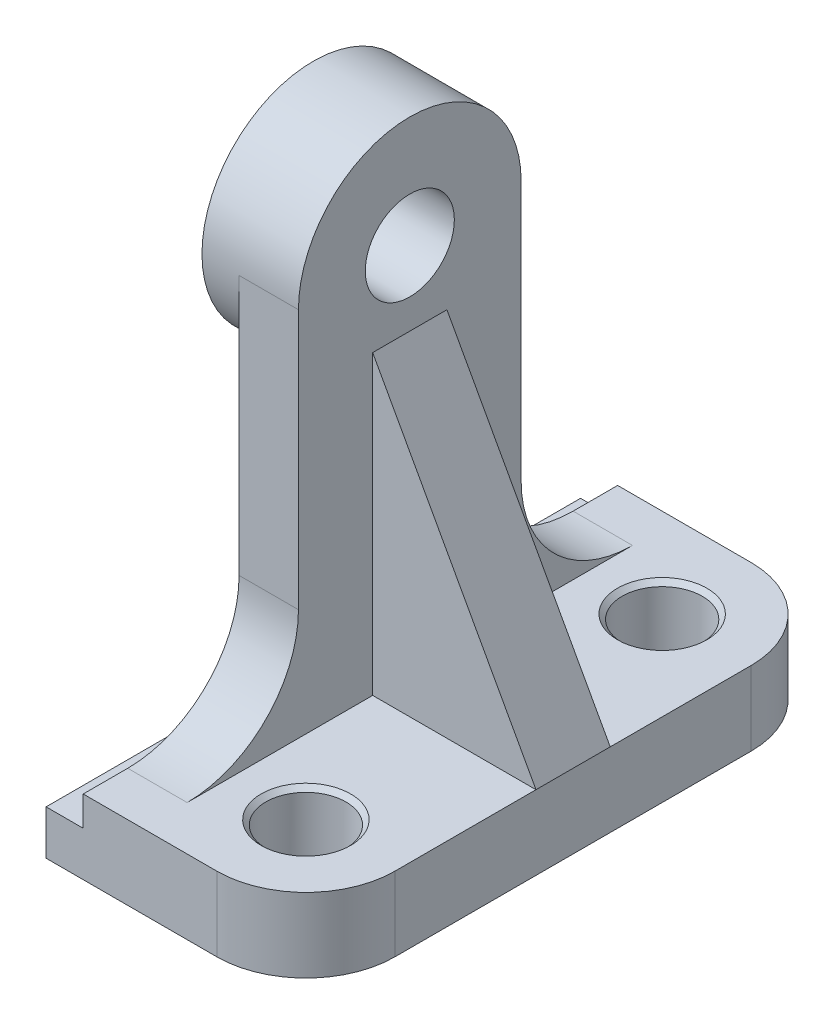
ISO-10303-21;
HEADER;
FILE_DESCRIPTION(('STEP AP214'),'2;1');
FILE_NAME('part.step','',(''),(''),'','','');
FILE_SCHEMA(('AUTOMOTIVE_DESIGN { 1 0 10303 214 1 1 1 1 }'));
ENDSEC;
DATA;
#1=APPLICATION_CONTEXT('core data for automotive mechanical design processes');
#2=APPLICATION_PROTOCOL_DEFINITION('international standard','automotive_design',2000,#1);
#3=PRODUCT_CONTEXT('',#1,'mechanical');
#4=PRODUCT('Part','Part','',(#3));
#5=PRODUCT_RELATED_PRODUCT_CATEGORY('part','',(#4));
#6=PRODUCT_DEFINITION_FORMATION('','',#4);
#7=PRODUCT_DEFINITION_CONTEXT('part definition',#1,'design');
#8=PRODUCT_DEFINITION('design','',#6,#7);
#9=PRODUCT_DEFINITION_SHAPE('','',#8);
#10=(LENGTH_UNIT() NAMED_UNIT(*) SI_UNIT(.MILLI.,.METRE.));
#11=(NAMED_UNIT(*) PLANE_ANGLE_UNIT() SI_UNIT($,.RADIAN.));
#12=(NAMED_UNIT(*) SI_UNIT($,.STERADIAN.) SOLID_ANGLE_UNIT());
#13=UNCERTAINTY_MEASURE_WITH_UNIT(LENGTH_MEASURE(1.E-05),#10,'distance_accuracy_value','');
#14=(GEOMETRIC_REPRESENTATION_CONTEXT(3) GLOBAL_UNCERTAINTY_ASSIGNED_CONTEXT((#13)) GLOBAL_UNIT_ASSIGNED_CONTEXT((#10,
#11,#12)) REPRESENTATION_CONTEXT('',''));
#15=CARTESIAN_POINT('',(0.,0.,0.));
#16=DIRECTION('',(0.,0.,1.));
#17=DIRECTION('',(1.,0.,0.));
#18=AXIS2_PLACEMENT_3D('',#15,#16,#17);
#19=CARTESIAN_POINT('',(5.,10.,36.));
#20=DIRECTION('',(0.,-1.,0.));
#21=DIRECTION('',(0.,0.,-1.));
#22=AXIS2_PLACEMENT_3D('',#19,#20,#21);
#23=PLANE('',#22);
#24=CARTESIAN_POINT('',(23.,10.,-24.));
#25=DIRECTION('',(0.,1.,0.));
#26=DIRECTION('',(0.,0.,1.));
#27=AXIS2_PLACEMENT_3D('',#24,#25,#26);
#28=CIRCLE('',#27,6.025);
#29=CARTESIAN_POINT('',(23.,10.,-17.975));
#30=VERTEX_POINT('',#29);
#31=EDGE_CURVE('E215',#30,#30,#28,.T.);
#32=ORIENTED_EDGE('',*,*,#31,.F.);
#33=EDGE_LOOP('',(#32));
#34=FACE_BOUND('',#33,.T.);
#35=DIRECTION('',(-1.,0.,0.));
#36=VECTOR('',#35,1.);
#37=CARTESIAN_POINT('',(5.,10.,-5.));
#38=LINE('',#37,#36);
#39=CARTESIAN_POINT('',(35.,10.,-5.));
#40=VERTEX_POINT('',#39);
#41=CARTESIAN_POINT('',(13.,10.,-5.));
#42=VERTEX_POINT('',#41);
#43=EDGE_CURVE('E67',#40,#42,#38,.T.);
#44=ORIENTED_EDGE('',*,*,#43,.F.);
#45=DIRECTION('',(0.,0.,-1.));
#46=VECTOR('',#45,1.);
#47=CARTESIAN_POINT('',(35.,10.,36.));
#48=LINE('',#47,#46);
#49=CARTESIAN_POINT('',(35.,10.,-24.));
#50=VERTEX_POINT('',#49);
#51=EDGE_CURVE('E316',#40,#50,#48,.T.);
#52=ORIENTED_EDGE('',*,*,#51,.T.);
#53=CARTESIAN_POINT('',(23.,10.,-24.));
#54=DIRECTION('',(0.,-1.,0.));
#55=DIRECTION('',(0.,0.,-1.));
#56=AXIS2_PLACEMENT_3D('',#53,#54,#55);
#57=CIRCLE('',#56,12.);
#58=CARTESIAN_POINT('',(23.,10.,-36.));
#59=VERTEX_POINT('',#58);
#60=EDGE_CURVE('E364',#50,#59,#57,.F.);
#61=ORIENTED_EDGE('',*,*,#60,.T.);
#62=DIRECTION('',(-1.,0.,0.));
#63=VECTOR('',#62,1.);
#64=CARTESIAN_POINT('',(5.,10.,-36.));
#65=LINE('',#64,#63);
#66=CARTESIAN_POINT('',(5.,10.,-36.));
#67=VERTEX_POINT('',#66);
#68=EDGE_CURVE('E289',#59,#67,#65,.T.);
#69=ORIENTED_EDGE('',*,*,#68,.T.);
#70=DIRECTION('',(0.,0.,-1.));
#71=VECTOR('',#70,1.);
#72=CARTESIAN_POINT('',(5.,10.,36.));
#73=LINE('',#72,#71);
#74=CARTESIAN_POINT('',(5.,10.,-30.));
#75=VERTEX_POINT('',#74);
#76=EDGE_CURVE('E311',#75,#67,#73,.T.);
#77=ORIENTED_EDGE('',*,*,#76,.F.);
#78=DIRECTION('',(-1.,0.,0.));
#79=VECTOR('',#78,1.);
#80=CARTESIAN_POINT('',(5.,10.,-30.));
#81=LINE('',#80,#79);
#82=CARTESIAN_POINT('',(13.,10.,-30.));
#83=VERTEX_POINT('',#82);
#84=EDGE_CURVE('E331',#75,#83,#81,.F.);
#85=ORIENTED_EDGE('',*,*,#84,.T.);
#86=DIRECTION('',(0.,0.,1.));
#87=VECTOR('',#86,1.);
#88=CARTESIAN_POINT('',(13.,10.,-15.));
#89=LINE('',#88,#87);
#90=EDGE_CURVE('E247',#83,#42,#89,.T.);
#91=ORIENTED_EDGE('',*,*,#90,.T.);
#92=EDGE_LOOP('',(#44,#52,#61,#69,#77,#85,#91));
#93=FACE_BOUND('',#92,.T.);
#94=ADVANCED_FACE('F49',(#34,#93),#23,.F.);
#95=CARTESIAN_POINT('',(5.,6.,36.));
#96=DIRECTION('',(1.,0.,0.));
#97=DIRECTION('',(0.,0.,-1.));
#98=AXIS2_PLACEMENT_3D('',#95,#96,#97);
#99=PLANE('',#98);
#100=DIRECTION('',(0.,1.,0.));
#101=VECTOR('',#100,1.);
#102=CARTESIAN_POINT('',(5.,10.,15.));
#103=LINE('',#102,#101);
#104=CARTESIAN_POINT('',(5.,25.,15.));
#105=VERTEX_POINT('',#104);
#106=CARTESIAN_POINT('',(5.,60.,15.));
#107=VERTEX_POINT('',#106);
#108=EDGE_CURVE('E242',#105,#107,#103,.T.);
#109=ORIENTED_EDGE('',*,*,#108,.T.);
#110=CARTESIAN_POINT('',(5.,60.,0.));
#111=DIRECTION('',(-1.,0.,0.));
#112=DIRECTION('',(0.,0.,1.));
#113=AXIS2_PLACEMENT_3D('',#110,#111,#112);
#114=CIRCLE('',#113,15.);
#115=CARTESIAN_POINT('',(5.,60.,-15.));
#116=VERTEX_POINT('',#115);
#117=EDGE_CURVE('E234',#116,#107,#114,.T.);
#118=ORIENTED_EDGE('',*,*,#117,.F.);
#119=DIRECTION('',(0.,-1.,0.));
#120=VECTOR('',#119,1.);
#121=CARTESIAN_POINT('',(5.,60.,-15.));
#122=LINE('',#121,#120);
#123=CARTESIAN_POINT('',(5.,25.,-15.));
#124=VERTEX_POINT('',#123);
#125=EDGE_CURVE('E233',#116,#124,#122,.T.);
#126=ORIENTED_EDGE('',*,*,#125,.T.);
#127=CARTESIAN_POINT('',(5.,25.,-30.));
#128=DIRECTION('',(1.,0.,0.));
#129=DIRECTION('',(0.,0.,-1.));
#130=AXIS2_PLACEMENT_3D('',#127,#128,#129);
#131=CIRCLE('',#130,15.);
#132=EDGE_CURVE('E338',#124,#75,#131,.T.);
#133=ORIENTED_EDGE('',*,*,#132,.T.);
#134=ORIENTED_EDGE('',*,*,#76,.T.);
#135=DIRECTION('',(0.,-1.,0.));
#136=VECTOR('',#135,1.);
#137=CARTESIAN_POINT('',(5.,6.,-36.));
#138=LINE('',#137,#136);
#139=CARTESIAN_POINT('',(5.,6.,-36.));
#140=VERTEX_POINT('',#139);
#141=EDGE_CURVE('E292',#67,#140,#138,.T.);
#142=ORIENTED_EDGE('',*,*,#141,.T.);
#143=DIRECTION('',(0.,0.,-1.));
#144=VECTOR('',#143,1.);
#145=CARTESIAN_POINT('',(5.,6.,36.));
#146=LINE('',#145,#144);
#147=CARTESIAN_POINT('',(5.,6.,36.));
#148=VERTEX_POINT('',#147);
#149=EDGE_CURVE('E308',#148,#140,#146,.T.);
#150=ORIENTED_EDGE('',*,*,#149,.F.);
#151=DIRECTION('',(0.,-1.,0.));
#152=VECTOR('',#151,1.);
#153=CARTESIAN_POINT('',(5.,6.,36.));
#154=LINE('',#153,#152);
#155=CARTESIAN_POINT('',(5.,10.,36.));
#156=VERTEX_POINT('',#155);
#157=EDGE_CURVE('E276',#156,#148,#154,.T.);
#158=ORIENTED_EDGE('',*,*,#157,.F.);
#159=CARTESIAN_POINT('',(5.,10.,30.));
#160=VERTEX_POINT('',#159);
#161=EDGE_CURVE('E312',#156,#160,#73,.T.);
#162=ORIENTED_EDGE('',*,*,#161,.T.);
#163=CARTESIAN_POINT('',(5.,25.,30.));
#164=DIRECTION('',(1.,0.,0.));
#165=DIRECTION('',(0.,0.,-1.));
#166=AXIS2_PLACEMENT_3D('',#163,#164,#165);
#167=CIRCLE('',#166,15.);
#168=EDGE_CURVE('E344',#160,#105,#167,.T.);
#169=ORIENTED_EDGE('',*,*,#168,.T.);
#170=EDGE_LOOP('',(#109,#118,#126,#133,#134,#142,#150,#158,#162,#169));
#171=FACE_BOUND('',#170,.T.);
#172=ADVANCED_FACE('F398',(#171),#99,.F.);
#173=CARTESIAN_POINT('',(23.,10.,24.));
#174=DIRECTION('',(0.,1.,0.));
#175=DIRECTION('',(0.,0.,1.));
#176=AXIS2_PLACEMENT_3D('',#173,#174,#175);
#177=CIRCLE('',#176,6.025);
#178=CARTESIAN_POINT('',(23.,10.,30.025));
#179=VERTEX_POINT('',#178);
#180=EDGE_CURVE('E207',#179,#179,#177,.T.);
#181=ORIENTED_EDGE('',*,*,#180,.F.);
#182=EDGE_LOOP('',(#181));
#183=FACE_BOUND('',#182,.T.);
#184=CARTESIAN_POINT('',(35.,10.,24.));
#185=VERTEX_POINT('',#184);
#186=CARTESIAN_POINT('',(35.,10.,5.));
#187=VERTEX_POINT('',#186);
#188=EDGE_CURVE('E317',#185,#187,#48,.T.);
#189=ORIENTED_EDGE('',*,*,#188,.T.);
#190=DIRECTION('',(-1.,0.,0.));
#191=VECTOR('',#190,1.);
#192=CARTESIAN_POINT('',(5.,10.,5.));
#193=LINE('',#192,#191);
#194=CARTESIAN_POINT('',(13.,10.,5.));
#195=VERTEX_POINT('',#194);
#196=EDGE_CURVE('E190',#187,#195,#193,.T.);
#197=ORIENTED_EDGE('',*,*,#196,.T.);
#198=CARTESIAN_POINT('',(13.,10.,30.));
#199=VERTEX_POINT('',#198);
#200=EDGE_CURVE('E246',#195,#199,#89,.T.);
#201=ORIENTED_EDGE('',*,*,#200,.T.);
#202=DIRECTION('',(-1.,0.,0.));
#203=VECTOR('',#202,1.);
#204=CARTESIAN_POINT('',(5.,10.,30.));
#205=LINE('',#204,#203);
#206=EDGE_CURVE('E327',#199,#160,#205,.T.);
#207=ORIENTED_EDGE('',*,*,#206,.T.);
#208=ORIENTED_EDGE('',*,*,#161,.F.);
#209=DIRECTION('',(-1.,0.,0.));
#210=VECTOR('',#209,1.);
#211=CARTESIAN_POINT('',(5.,10.,36.));
#212=LINE('',#211,#210);
#213=CARTESIAN_POINT('',(23.,10.,36.));
#214=VERTEX_POINT('',#213);
#215=EDGE_CURVE('E272',#214,#156,#212,.T.);
#216=ORIENTED_EDGE('',*,*,#215,.F.);
#217=CARTESIAN_POINT('',(23.,10.,24.));
#218=DIRECTION('',(0.,-1.,0.));
#219=DIRECTION('',(0.,0.,-1.));
#220=AXIS2_PLACEMENT_3D('',#217,#218,#219);
#221=CIRCLE('',#220,12.);
#222=EDGE_CURVE('E361',#214,#185,#221,.F.);
#223=ORIENTED_EDGE('',*,*,#222,.T.);
#224=EDGE_LOOP('',(#189,#197,#201,#207,#208,#216,#223));
#225=FACE_BOUND('',#224,.T.);
#226=ADVANCED_FACE('F401',(#183,#225),#23,.F.);
#227=CARTESIAN_POINT('',(35.,0.,36.));
#228=DIRECTION('',(0.,1.,0.));
#229=DIRECTION('',(-1.,0.,0.));
#230=AXIS2_PLACEMENT_3D('',#227,#228,#229);
#231=PLANE('',#230);
#232=CARTESIAN_POINT('',(23.,0.,24.));
#233=DIRECTION('',(0.,1.,0.));
#234=DIRECTION('',(-1.,0.,0.));
#235=AXIS2_PLACEMENT_3D('',#232,#233,#234);
#236=CIRCLE('',#235,5.4);
#237=CARTESIAN_POINT('',(17.6,0.,24.));
#238=VERTEX_POINT('',#237);
#239=EDGE_CURVE('E53',#238,#238,#236,.T.);
#240=ORIENTED_EDGE('',*,*,#239,.T.);
#241=EDGE_LOOP('',(#240));
#242=FACE_BOUND('',#241,.T.);
#243=DIRECTION('',(0.,0.,-1.));
#244=VECTOR('',#243,1.);
#245=CARTESIAN_POINT('',(0.,0.,36.));
#246=LINE('',#245,#244);
#247=CARTESIAN_POINT('',(0.,0.,36.));
#248=VERTEX_POINT('',#247);
#249=CARTESIAN_POINT('',(0.,0.,-36.));
#250=VERTEX_POINT('',#249);
#251=EDGE_CURVE('E285',#248,#250,#246,.T.);
#252=ORIENTED_EDGE('',*,*,#251,.T.);
#253=DIRECTION('',(1.,0.,0.));
#254=VECTOR('',#253,1.);
#255=CARTESIAN_POINT('',(35.,0.,-36.));
#256=LINE('',#255,#254);
#257=CARTESIAN_POINT('',(23.,0.,-36.));
#258=VERTEX_POINT('',#257);
#259=EDGE_CURVE('E264',#250,#258,#256,.T.);
#260=ORIENTED_EDGE('',*,*,#259,.T.);
#261=CARTESIAN_POINT('',(23.,0.,-24.));
#262=DIRECTION('',(0.,1.,0.));
#263=DIRECTION('',(-1.,0.,0.));
#264=AXIS2_PLACEMENT_3D('',#261,#262,#263);
#265=CIRCLE('',#264,12.);
#266=CARTESIAN_POINT('',(35.,0.,-24.));
#267=VERTEX_POINT('',#266);
#268=EDGE_CURVE('E59',#258,#267,#265,.F.);
#269=ORIENTED_EDGE('',*,*,#268,.T.);
#270=DIRECTION('',(0.,0.,-1.));
#271=VECTOR('',#270,1.);
#272=CARTESIAN_POINT('',(35.,0.,36.));
#273=LINE('',#272,#271);
#274=CARTESIAN_POINT('',(35.,0.,24.));
#275=VERTEX_POINT('',#274);
#276=EDGE_CURVE('E320',#275,#267,#273,.T.);
#277=ORIENTED_EDGE('',*,*,#276,.F.);
#278=CARTESIAN_POINT('',(23.,0.,24.));
#279=DIRECTION('',(0.,1.,0.));
#280=DIRECTION('',(-1.,0.,0.));
#281=AXIS2_PLACEMENT_3D('',#278,#279,#280);
#282=CIRCLE('',#281,12.);
#283=CARTESIAN_POINT('',(23.,0.,36.));
#284=VERTEX_POINT('',#283);
#285=EDGE_CURVE('E370',#275,#284,#282,.F.);
#286=ORIENTED_EDGE('',*,*,#285,.T.);
#287=DIRECTION('',(1.,0.,0.));
#288=VECTOR('',#287,1.);
#289=CARTESIAN_POINT('',(35.,0.,36.));
#290=LINE('',#289,#288);
#291=EDGE_CURVE('E268',#248,#284,#290,.T.);
#292=ORIENTED_EDGE('',*,*,#291,.F.);
#293=EDGE_LOOP('',(#252,#260,#269,#277,#286,#292));
#294=FACE_BOUND('',#293,.T.);
#295=CARTESIAN_POINT('',(23.,0.,-24.));
#296=DIRECTION('',(0.,1.,0.));
#297=DIRECTION('',(-1.,0.,0.));
#298=AXIS2_PLACEMENT_3D('',#295,#296,#297);
#299=CIRCLE('',#298,5.4);
#300=CARTESIAN_POINT('',(17.6,0.,-24.));
#301=VERTEX_POINT('',#300);
#302=EDGE_CURVE('E223',#301,#301,#299,.T.);
#303=ORIENTED_EDGE('',*,*,#302,.T.);
#304=EDGE_LOOP('',(#303));
#305=FACE_BOUND('',#304,.T.);
#306=ADVANCED_FACE('F379',(#242,#294,#305),#231,.F.);
#307=CARTESIAN_POINT('',(35.,10.,36.));
#308=DIRECTION('',(-1.,0.,0.));
#309=DIRECTION('',(0.,0.,1.));
#310=AXIS2_PLACEMENT_3D('',#307,#308,#309);
#311=PLANE('',#310);
#312=ORIENTED_EDGE('',*,*,#276,.T.);
#313=DIRECTION('',(0.,1.,0.));
#314=VECTOR('',#313,1.);
#315=CARTESIAN_POINT('',(35.,10.,-24.));
#316=LINE('',#315,#314);
#317=EDGE_CURVE('E357',#267,#50,#316,.T.);
#318=ORIENTED_EDGE('',*,*,#317,.T.);
#319=ORIENTED_EDGE('',*,*,#51,.F.);
#320=DIRECTION('',(0.,0.,-1.));
#321=VECTOR('',#320,1.);
#322=CARTESIAN_POINT('',(35.,10.,36.));
#323=LINE('',#322,#321);
#324=EDGE_CURVE('E74',#187,#40,#323,.T.);
#325=ORIENTED_EDGE('',*,*,#324,.F.);
#326=ORIENTED_EDGE('',*,*,#188,.F.);
#327=DIRECTION('',(0.,1.,0.));
#328=VECTOR('',#327,1.);
#329=CARTESIAN_POINT('',(35.,10.,24.));
#330=LINE('',#329,#328);
#331=EDGE_CURVE('E351',#185,#275,#330,.F.);
#332=ORIENTED_EDGE('',*,*,#331,.T.);
#333=EDGE_LOOP('',(#312,#318,#319,#325,#326,#332));
#334=FACE_BOUND('',#333,.T.);
#335=ADVANCED_FACE('F415',(#334),#311,.F.);
#336=CARTESIAN_POINT('',(0.,6.,36.));
#337=DIRECTION('',(0.,-1.,0.));
#338=DIRECTION('',(0.,0.,-1.));
#339=AXIS2_PLACEMENT_3D('',#336,#337,#338);
#340=PLANE('',#339);
#341=ORIENTED_EDGE('',*,*,#149,.T.);
#342=DIRECTION('',(-1.,0.,0.));
#343=VECTOR('',#342,1.);
#344=CARTESIAN_POINT('',(0.,6.,-36.));
#345=LINE('',#344,#343);
#346=CARTESIAN_POINT('',(0.,6.,-36.));
#347=VERTEX_POINT('',#346);
#348=EDGE_CURVE('E296',#140,#347,#345,.T.);
#349=ORIENTED_EDGE('',*,*,#348,.T.);
#350=DIRECTION('',(0.,0.,-1.));
#351=VECTOR('',#350,1.);
#352=CARTESIAN_POINT('',(0.,6.,36.));
#353=LINE('',#352,#351);
#354=CARTESIAN_POINT('',(0.,6.,36.));
#355=VERTEX_POINT('',#354);
#356=EDGE_CURVE('E305',#355,#347,#353,.T.);
#357=ORIENTED_EDGE('',*,*,#356,.F.);
#358=DIRECTION('',(-1.,0.,0.));
#359=VECTOR('',#358,1.);
#360=CARTESIAN_POINT('',(0.,6.,36.));
#361=LINE('',#360,#359);
#362=EDGE_CURVE('E279',#148,#355,#361,.T.);
#363=ORIENTED_EDGE('',*,*,#362,.F.);
#364=EDGE_LOOP('',(#341,#349,#357,#363));
#365=FACE_BOUND('',#364,.T.);
#366=ADVANCED_FACE('F476',(#365),#340,.F.);
#367=CARTESIAN_POINT('',(0.,0.,36.));
#368=DIRECTION('',(1.,0.,0.));
#369=DIRECTION('',(0.,0.,-1.));
#370=AXIS2_PLACEMENT_3D('',#367,#368,#369);
#371=PLANE('',#370);
#372=ORIENTED_EDGE('',*,*,#356,.T.);
#373=DIRECTION('',(0.,-1.,0.));
#374=VECTOR('',#373,1.);
#375=CARTESIAN_POINT('',(0.,0.,-36.));
#376=LINE('',#375,#374);
#377=EDGE_CURVE('E273',#347,#250,#376,.T.);
#378=ORIENTED_EDGE('',*,*,#377,.T.);
#379=ORIENTED_EDGE('',*,*,#251,.F.);
#380=DIRECTION('',(0.,-1.,0.));
#381=VECTOR('',#380,1.);
#382=CARTESIAN_POINT('',(0.,0.,36.));
#383=LINE('',#382,#381);
#384=EDGE_CURVE('E282',#355,#248,#383,.T.);
#385=ORIENTED_EDGE('',*,*,#384,.F.);
#386=EDGE_LOOP('',(#372,#378,#379,#385));
#387=FACE_BOUND('',#386,.T.);
#388=ADVANCED_FACE('F454',(#387),#371,.F.);
#389=CARTESIAN_POINT('',(0.,0.,36.));
#390=DIRECTION('',(0.,0.,-1.));
#391=DIRECTION('',(-1.,0.,0.));
#392=AXIS2_PLACEMENT_3D('',#389,#390,#391);
#393=PLANE('',#392);
#394=ORIENTED_EDGE('',*,*,#291,.T.);
#395=DIRECTION('',(0.,1.,0.));
#396=VECTOR('',#395,1.);
#397=CARTESIAN_POINT('',(23.,0.,36.));
#398=LINE('',#397,#396);
#399=EDGE_CURVE('E11',#284,#214,#398,.T.);
#400=ORIENTED_EDGE('',*,*,#399,.T.);
#401=ORIENTED_EDGE('',*,*,#215,.T.);
#402=ORIENTED_EDGE('',*,*,#157,.T.);
#403=ORIENTED_EDGE('',*,*,#362,.T.);
#404=ORIENTED_EDGE('',*,*,#384,.T.);
#405=EDGE_LOOP('',(#394,#400,#401,#402,#403,#404));
#406=FACE_BOUND('',#405,.T.);
#407=ADVANCED_FACE('F469',(#406),#393,.F.);
#408=CARTESIAN_POINT('',(0.,0.,-36.));
#409=DIRECTION('',(0.,0.,-1.));
#410=DIRECTION('',(-1.,0.,0.));
#411=AXIS2_PLACEMENT_3D('',#408,#409,#410);
#412=PLANE('',#411);
#413=ORIENTED_EDGE('',*,*,#68,.F.);
#414=DIRECTION('',(0.,1.,0.));
#415=VECTOR('',#414,1.);
#416=CARTESIAN_POINT('',(23.,0.,-36.));
#417=LINE('',#416,#415);
#418=EDGE_CURVE('E367',#59,#258,#417,.F.);
#419=ORIENTED_EDGE('',*,*,#418,.T.);
#420=ORIENTED_EDGE('',*,*,#259,.F.);
#421=ORIENTED_EDGE('',*,*,#377,.F.);
#422=ORIENTED_EDGE('',*,*,#348,.F.);
#423=ORIENTED_EDGE('',*,*,#141,.F.);
#424=EDGE_LOOP('',(#413,#419,#420,#421,#422,#423));
#425=FACE_BOUND('',#424,.T.);
#426=ADVANCED_FACE('F459',(#425),#412,.T.);
#427=CARTESIAN_POINT('',(13.,60.,0.));
#428=DIRECTION('',(-1.,0.,0.));
#429=DIRECTION('',(0.,0.,1.));
#430=AXIS2_PLACEMENT_3D('',#427,#428,#429);
#431=CYLINDRICAL_SURFACE('',#430,15.);
#432=CARTESIAN_POINT('',(0.,60.,0.));
#433=DIRECTION('',(-1.,0.,0.));
#434=DIRECTION('',(0.,0.,1.));
#435=AXIS2_PLACEMENT_3D('',#432,#433,#434);
#436=CIRCLE('',#435,15.);
#437=CARTESIAN_POINT('',(0.,60.,15.));
#438=VERTEX_POINT('',#437);
#439=EDGE_CURVE('E229',#438,#438,#436,.T.);
#440=ORIENTED_EDGE('',*,*,#439,.F.);
#441=EDGE_LOOP('',(#440));
#442=FACE_BOUND('',#441,.T.);
#443=ORIENTED_EDGE('',*,*,#117,.T.);
#444=DIRECTION('',(-1.,0.,0.));
#445=VECTOR('',#444,1.);
#446=CARTESIAN_POINT('',(13.,60.,15.));
#447=LINE('',#446,#445);
#448=CARTESIAN_POINT('',(13.,60.,15.));
#449=VERTEX_POINT('',#448);
#450=EDGE_CURVE('E260',#449,#107,#447,.T.);
#451=ORIENTED_EDGE('',*,*,#450,.F.);
#452=CARTESIAN_POINT('',(13.,60.,0.));
#453=DIRECTION('',(-1.,0.,0.));
#454=DIRECTION('',(0.,0.,1.));
#455=AXIS2_PLACEMENT_3D('',#452,#453,#454);
#456=CIRCLE('',#455,15.);
#457=CARTESIAN_POINT('',(13.,60.,-15.));
#458=VERTEX_POINT('',#457);
#459=EDGE_CURVE('E237',#449,#458,#456,.T.);
#460=ORIENTED_EDGE('',*,*,#459,.T.);
#461=DIRECTION('',(-1.,0.,0.));
#462=VECTOR('',#461,1.);
#463=CARTESIAN_POINT('',(13.,60.,-15.));
#464=LINE('',#463,#462);
#465=EDGE_CURVE('E253',#458,#116,#464,.T.);
#466=ORIENTED_EDGE('',*,*,#465,.T.);
#467=EDGE_LOOP('',(#443,#451,#460,#466));
#468=FACE_BOUND('',#467,.T.);
#469=ADVANCED_FACE('F495',(#442,#468),#431,.T.);
#470=CARTESIAN_POINT('',(13.,10.,15.));
#471=DIRECTION('',(0.,0.,1.));
#472=DIRECTION('',(1.,0.,0.));
#473=AXIS2_PLACEMENT_3D('',#470,#471,#472);
#474=PLANE('',#473);
#475=ORIENTED_EDGE('',*,*,#108,.F.);
#476=DIRECTION('',(-1.,0.,0.));
#477=VECTOR('',#476,1.);
#478=CARTESIAN_POINT('',(13.,25.,15.));
#479=LINE('',#478,#477);
#480=CARTESIAN_POINT('',(13.,25.,15.));
#481=VERTEX_POINT('',#480);
#482=EDGE_CURVE('E335',#105,#481,#479,.F.);
#483=ORIENTED_EDGE('',*,*,#482,.T.);
#484=DIRECTION('',(0.,1.,0.));
#485=VECTOR('',#484,1.);
#486=CARTESIAN_POINT('',(13.,10.,15.));
#487=LINE('',#486,#485);
#488=EDGE_CURVE('E250',#481,#449,#487,.T.);
#489=ORIENTED_EDGE('',*,*,#488,.T.);
#490=ORIENTED_EDGE('',*,*,#450,.T.);
#491=EDGE_LOOP('',(#475,#483,#489,#490));
#492=FACE_BOUND('',#491,.T.);
#493=ADVANCED_FACE('F492',(#492),#474,.T.);
#494=CARTESIAN_POINT('',(13.,60.,-15.));
#495=DIRECTION('',(0.,0.,-1.));
#496=DIRECTION('',(-1.,0.,0.));
#497=AXIS2_PLACEMENT_3D('',#494,#495,#496);
#498=PLANE('',#497);
#499=DIRECTION('',(0.,-1.,0.));
#500=VECTOR('',#499,1.);
#501=CARTESIAN_POINT('',(13.,60.,-15.));
#502=LINE('',#501,#500);
#503=CARTESIAN_POINT('',(13.,25.,-15.));
#504=VERTEX_POINT('',#503);
#505=EDGE_CURVE('E241',#458,#504,#502,.T.);
#506=ORIENTED_EDGE('',*,*,#505,.T.);
#507=DIRECTION('',(-1.,0.,0.));
#508=VECTOR('',#507,1.);
#509=CARTESIAN_POINT('',(13.,25.,-15.));
#510=LINE('',#509,#508);
#511=EDGE_CURVE('E323',#504,#124,#510,.T.);
#512=ORIENTED_EDGE('',*,*,#511,.T.);
#513=ORIENTED_EDGE('',*,*,#125,.F.);
#514=ORIENTED_EDGE('',*,*,#465,.F.);
#515=EDGE_LOOP('',(#506,#512,#513,#514));
#516=FACE_BOUND('',#515,.T.);
#517=ADVANCED_FACE('F500',(#516),#498,.T.);
#518=CARTESIAN_POINT('',(13.,60.,0.));
#519=DIRECTION('',(-1.,0.,0.));
#520=DIRECTION('',(0.,0.,1.));
#521=AXIS2_PLACEMENT_3D('',#518,#519,#520);
#522=PLANE('',#521);
#523=CARTESIAN_POINT('',(13.,60.,0.));
#524=DIRECTION('',(1.,0.,0.));
#525=DIRECTION('',(0.,0.,-1.));
#526=AXIS2_PLACEMENT_3D('',#523,#524,#525);
#527=CIRCLE('',#526,6.00000000000002);
#528=CARTESIAN_POINT('',(13.,60.,-6.00000000000002));
#529=VERTEX_POINT('',#528);
#530=EDGE_CURVE('E224',#529,#529,#527,.T.);
#531=ORIENTED_EDGE('',*,*,#530,.F.);
#532=EDGE_LOOP('',(#531));
#533=FACE_BOUND('',#532,.T.);
#534=ORIENTED_EDGE('',*,*,#200,.F.);
#535=DIRECTION('',(0.,1.,0.));
#536=VECTOR('',#535,1.);
#537=CARTESIAN_POINT('',(13.,60.,5.));
#538=LINE('',#537,#536);
#539=CARTESIAN_POINT('',(13.,50.,5.));
#540=VERTEX_POINT('',#539);
#541=EDGE_CURVE('E178',#195,#540,#538,.T.);
#542=ORIENTED_EDGE('',*,*,#541,.T.);
#543=DIRECTION('',(0.,0.,-1.));
#544=VECTOR('',#543,1.);
#545=CARTESIAN_POINT('',(13.,50.,0.));
#546=LINE('',#545,#544);
#547=CARTESIAN_POINT('',(13.,50.,-5.));
#548=VERTEX_POINT('',#547);
#549=EDGE_CURVE('E172',#540,#548,#546,.T.);
#550=ORIENTED_EDGE('',*,*,#549,.T.);
#551=DIRECTION('',(0.,1.,0.));
#552=VECTOR('',#551,1.);
#553=CARTESIAN_POINT('',(13.,60.,-5.));
#554=LINE('',#553,#552);
#555=EDGE_CURVE('E176',#42,#548,#554,.T.);
#556=ORIENTED_EDGE('',*,*,#555,.F.);
#557=ORIENTED_EDGE('',*,*,#90,.F.);
#558=CARTESIAN_POINT('',(13.,25.,-30.));
#559=DIRECTION('',(-1.,0.,0.));
#560=DIRECTION('',(0.,0.,1.));
#561=AXIS2_PLACEMENT_3D('',#558,#559,#560);
#562=CIRCLE('',#561,15.);
#563=EDGE_CURVE('E341',#83,#504,#562,.T.);
#564=ORIENTED_EDGE('',*,*,#563,.T.);
#565=ORIENTED_EDGE('',*,*,#505,.F.);
#566=ORIENTED_EDGE('',*,*,#459,.F.);
#567=ORIENTED_EDGE('',*,*,#488,.F.);
#568=CARTESIAN_POINT('',(13.,25.,30.));
#569=DIRECTION('',(-1.,0.,0.));
#570=DIRECTION('',(0.,0.,1.));
#571=AXIS2_PLACEMENT_3D('',#568,#569,#570);
#572=CIRCLE('',#571,15.);
#573=EDGE_CURVE('E347',#481,#199,#572,.T.);
#574=ORIENTED_EDGE('',*,*,#573,.T.);
#575=EDGE_LOOP('',(#534,#542,#550,#556,#557,#564,#565,#566,#567,#574));
#576=FACE_BOUND('',#575,.T.);
#577=ADVANCED_FACE('F175',(#533,#576),#522,.F.);
#578=CARTESIAN_POINT('',(13.,25.,-30.));
#579=DIRECTION('',(-1.,0.,0.));
#580=DIRECTION('',(0.,0.,1.));
#581=AXIS2_PLACEMENT_3D('',#578,#579,#580);
#582=CYLINDRICAL_SURFACE('',#581,15.);
#583=ORIENTED_EDGE('',*,*,#563,.F.);
#584=ORIENTED_EDGE('',*,*,#84,.F.);
#585=ORIENTED_EDGE('',*,*,#132,.F.);
#586=ORIENTED_EDGE('',*,*,#511,.F.);
#587=EDGE_LOOP('',(#583,#584,#585,#586));
#588=FACE_BOUND('',#587,.T.);
#589=ADVANCED_FACE('F502',(#588),#582,.F.);
#590=CARTESIAN_POINT('',(5.,25.,30.));
#591=DIRECTION('',(-1.,0.,0.));
#592=DIRECTION('',(0.,0.,1.));
#593=AXIS2_PLACEMENT_3D('',#590,#591,#592);
#594=CYLINDRICAL_SURFACE('',#593,15.);
#595=ORIENTED_EDGE('',*,*,#573,.F.);
#596=ORIENTED_EDGE('',*,*,#482,.F.);
#597=ORIENTED_EDGE('',*,*,#168,.F.);
#598=ORIENTED_EDGE('',*,*,#206,.F.);
#599=EDGE_LOOP('',(#595,#596,#597,#598));
#600=FACE_BOUND('',#599,.T.);
#601=ADVANCED_FACE('F488',(#600),#594,.F.);
#602=CARTESIAN_POINT('',(0.,60.,0.));
#603=DIRECTION('',(-1.,0.,0.));
#604=DIRECTION('',(0.,0.,1.));
#605=AXIS2_PLACEMENT_3D('',#602,#603,#604);
#606=PLANE('',#605);
#607=CARTESIAN_POINT('',(0.,60.,0.));
#608=DIRECTION('',(-1.,0.,0.));
#609=DIRECTION('',(0.,0.,1.));
#610=AXIS2_PLACEMENT_3D('',#607,#608,#609);
#611=CIRCLE('',#610,6.00000000000001);
#612=CARTESIAN_POINT('',(0.,60.,6.00000000000001));
#613=VERTEX_POINT('',#612);
#614=EDGE_CURVE('E228',#613,#613,#611,.T.);
#615=ORIENTED_EDGE('',*,*,#614,.F.);
#616=EDGE_LOOP('',(#615));
#617=FACE_BOUND('',#616,.T.);
#618=ORIENTED_EDGE('',*,*,#439,.T.);
#619=EDGE_LOOP('',(#618));
#620=FACE_BOUND('',#619,.T.);
#621=ADVANCED_FACE('F509',(#617,#620),#606,.T.);
#622=CARTESIAN_POINT('',(13.,60.,0.));
#623=DIRECTION('',(1.,0.,0.));
#624=DIRECTION('',(0.,0.,-1.));
#625=AXIS2_PLACEMENT_3D('',#622,#623,#624);
#626=CYLINDRICAL_SURFACE('',#625,6.00000000000001);
#627=ORIENTED_EDGE('',*,*,#614,.T.);
#628=EDGE_LOOP('',(#627));
#629=FACE_BOUND('',#628,.T.);
#630=ORIENTED_EDGE('',*,*,#530,.T.);
#631=EDGE_LOOP('',(#630));
#632=FACE_BOUND('',#631,.T.);
#633=ADVANCED_FACE('F515',(#629,#632),#626,.F.);
#634=CARTESIAN_POINT('',(23.,10.,-24.));
#635=DIRECTION('',(0.,-1.,0.));
#636=DIRECTION('',(0.,0.,-1.));
#637=AXIS2_PLACEMENT_3D('',#634,#635,#636);
#638=CYLINDRICAL_SURFACE('',#637,12.);
#639=ORIENTED_EDGE('',*,*,#268,.F.);
#640=ORIENTED_EDGE('',*,*,#418,.F.);
#641=ORIENTED_EDGE('',*,*,#60,.F.);
#642=ORIENTED_EDGE('',*,*,#317,.F.);
#643=EDGE_LOOP('',(#639,#640,#641,#642));
#644=FACE_BOUND('',#643,.T.);
#645=ADVANCED_FACE('F394',(#644),#638,.T.);
#646=CARTESIAN_POINT('',(23.,0.,24.));
#647=DIRECTION('',(0.,1.,0.));
#648=DIRECTION('',(0.,0.,1.));
#649=AXIS2_PLACEMENT_3D('',#646,#647,#648);
#650=CYLINDRICAL_SURFACE('',#649,12.);
#651=ORIENTED_EDGE('',*,*,#285,.F.);
#652=ORIENTED_EDGE('',*,*,#331,.F.);
#653=ORIENTED_EDGE('',*,*,#222,.F.);
#654=ORIENTED_EDGE('',*,*,#399,.F.);
#655=EDGE_LOOP('',(#651,#652,#653,#654));
#656=FACE_BOUND('',#655,.T.);
#657=ADVANCED_FACE('F51',(#656),#650,.T.);
#658=CARTESIAN_POINT('',(23.,10.,-24.));
#659=DIRECTION('',(0.,1.,0.));
#660=DIRECTION('',(0.,0.,1.));
#661=AXIS2_PLACEMENT_3D('',#658,#659,#660);
#662=CYLINDRICAL_SURFACE('',#661,5.4);
#663=CARTESIAN_POINT('',(23.,9.375,-24.));
#664=DIRECTION('',(0.,1.,0.));
#665=DIRECTION('',(0.,0.,1.));
#666=AXIS2_PLACEMENT_3D('',#663,#664,#665);
#667=CIRCLE('',#666,5.4);
#668=CARTESIAN_POINT('',(23.,9.375,-18.6));
#669=VERTEX_POINT('',#668);
#670=EDGE_CURVE('E219',#669,#669,#667,.T.);
#671=ORIENTED_EDGE('',*,*,#670,.T.);
#672=EDGE_LOOP('',(#671));
#673=FACE_BOUND('',#672,.T.);
#674=ORIENTED_EDGE('',*,*,#302,.F.);
#675=EDGE_LOOP('',(#674));
#676=FACE_BOUND('',#675,.T.);
#677=ADVANCED_FACE('F381',(#673,#676),#662,.F.);
#678=CARTESIAN_POINT('',(23.,10.,-24.));
#679=DIRECTION('',(0.,1.,0.));
#680=DIRECTION('',(0.,0.,1.));
#681=AXIS2_PLACEMENT_3D('',#678,#679,#680);
#682=CONICAL_SURFACE('',#681,6.025,0.785398163397447);
#683=ORIENTED_EDGE('',*,*,#670,.F.);
#684=EDGE_LOOP('',(#683));
#685=FACE_BOUND('',#684,.T.);
#686=ORIENTED_EDGE('',*,*,#31,.T.);
#687=EDGE_LOOP('',(#686));
#688=FACE_BOUND('',#687,.T.);
#689=ADVANCED_FACE('F383',(#685,#688),#682,.F.);
#690=CARTESIAN_POINT('',(23.,10.,24.));
#691=DIRECTION('',(0.,1.,0.));
#692=DIRECTION('',(0.,0.,1.));
#693=AXIS2_PLACEMENT_3D('',#690,#691,#692);
#694=CYLINDRICAL_SURFACE('',#693,5.4);
#695=CARTESIAN_POINT('',(23.,9.375,24.));
#696=DIRECTION('',(0.,1.,0.));
#697=DIRECTION('',(0.,0.,1.));
#698=AXIS2_PLACEMENT_3D('',#695,#696,#697);
#699=CIRCLE('',#698,5.4);
#700=CARTESIAN_POINT('',(23.,9.375,29.4));
#701=VERTEX_POINT('',#700);
#702=EDGE_CURVE('E211',#701,#701,#699,.T.);
#703=ORIENTED_EDGE('',*,*,#702,.T.);
#704=EDGE_LOOP('',(#703));
#705=FACE_BOUND('',#704,.T.);
#706=ORIENTED_EDGE('',*,*,#239,.F.);
#707=EDGE_LOOP('',(#706));
#708=FACE_BOUND('',#707,.T.);
#709=ADVANCED_FACE('F390',(#705,#708),#694,.F.);
#710=CARTESIAN_POINT('',(23.,10.,24.));
#711=DIRECTION('',(0.,1.,0.));
#712=DIRECTION('',(0.,0.,1.));
#713=AXIS2_PLACEMENT_3D('',#710,#711,#712);
#714=CONICAL_SURFACE('',#713,6.025,0.785398163397447);
#715=ORIENTED_EDGE('',*,*,#702,.F.);
#716=EDGE_LOOP('',(#715));
#717=FACE_BOUND('',#716,.T.);
#718=ORIENTED_EDGE('',*,*,#180,.T.);
#719=EDGE_LOOP('',(#718));
#720=FACE_BOUND('',#719,.T.);
#721=ADVANCED_FACE('F432',(#717,#720),#714,.F.);
#722=CARTESIAN_POINT('',(35.,10.,0.));
#723=DIRECTION('',(0.876215908676647,0.481918749772156,0.));
#724=DIRECTION('',(-0.481918749772156,0.876215908676647,0.));
#725=AXIS2_PLACEMENT_3D('',#722,#723,#724);
#726=PLANE('',#725);
#727=DIRECTION('',(-0.481918749772156,0.876215908676647,0.));
#728=VECTOR('',#727,1.);
#729=CARTESIAN_POINT('',(35.,10.,5.));
#730=LINE('',#729,#728);
#731=EDGE_CURVE('E194',#187,#540,#730,.T.);
#732=ORIENTED_EDGE('',*,*,#731,.F.);
#733=ORIENTED_EDGE('',*,*,#324,.T.);
#734=DIRECTION('',(-0.481918749772156,0.876215908676647,0.));
#735=VECTOR('',#734,1.);
#736=CARTESIAN_POINT('',(35.,10.,-5.));
#737=LINE('',#736,#735);
#738=EDGE_CURVE('E188',#40,#548,#737,.T.);
#739=ORIENTED_EDGE('',*,*,#738,.T.);
#740=ORIENTED_EDGE('',*,*,#549,.F.);
#741=EDGE_LOOP('',(#732,#733,#739,#740));
#742=FACE_BOUND('',#741,.T.);
#743=ADVANCED_FACE('F192',(#742),#726,.T.);
#744=CARTESIAN_POINT('',(17.5,37.5,5.));
#745=DIRECTION('',(0.,0.,1.));
#746=DIRECTION('',(1.,0.,0.));
#747=AXIS2_PLACEMENT_3D('',#744,#745,#746);
#748=PLANE('',#747);
#749=ORIENTED_EDGE('',*,*,#541,.F.);
#750=ORIENTED_EDGE('',*,*,#196,.F.);
#751=ORIENTED_EDGE('',*,*,#731,.T.);
#752=EDGE_LOOP('',(#749,#750,#751));
#753=FACE_BOUND('',#752,.T.);
#754=ADVANCED_FACE('F424',(#753),#748,.T.);
#755=CARTESIAN_POINT('',(17.5,37.5,-5.));
#756=DIRECTION('',(0.,0.,1.));
#757=DIRECTION('',(1.,0.,0.));
#758=AXIS2_PLACEMENT_3D('',#755,#756,#757);
#759=PLANE('',#758);
#760=ORIENTED_EDGE('',*,*,#43,.T.);
#761=ORIENTED_EDGE('',*,*,#555,.T.);
#762=ORIENTED_EDGE('',*,*,#738,.F.);
#763=EDGE_LOOP('',(#760,#761,#762));
#764=FACE_BOUND('',#763,.T.);
#765=ADVANCED_FACE('F187',(#764),#759,.F.);
#766=CLOSED_SHELL('',(#94,#172,#226,#306,#335,#366,#388,#407,#426,#469,#493,#517,#577,#589,#601,
#621,#633,#645,#657,#677,#689,#709,#721,#743,#754,#765));
#767=MANIFOLD_SOLID_BREP('B2',#766);
#768=ADVANCED_BREP_SHAPE_REPRESENTATION('',(#18,#767),#14);
#769=SHAPE_DEFINITION_REPRESENTATION(#9,#768);
ENDSEC;
END-ISO-10303-21;
